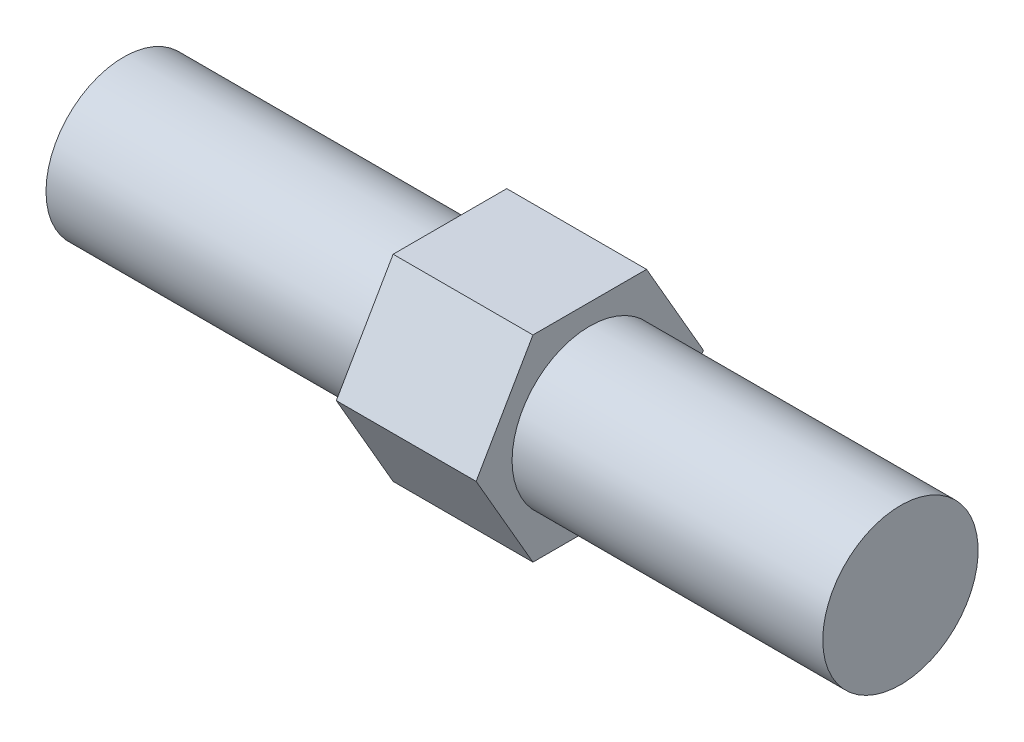
ISO-10303-21;
HEADER;
FILE_DESCRIPTION(('STEP AP214'),'2;1');
FILE_NAME('part.step','',(''),(''),'','','');
FILE_SCHEMA(('AUTOMOTIVE_DESIGN { 1 0 10303 214 1 1 1 1 }'));
ENDSEC;
DATA;
#1=APPLICATION_CONTEXT('core data for automotive mechanical design processes');
#2=APPLICATION_PROTOCOL_DEFINITION('international standard','automotive_design',2000,#1);
#3=PRODUCT_CONTEXT('',#1,'mechanical');
#4=PRODUCT('Part','Part','',(#3));
#5=PRODUCT_RELATED_PRODUCT_CATEGORY('part','',(#4));
#6=PRODUCT_DEFINITION_FORMATION('','',#4);
#7=PRODUCT_DEFINITION_CONTEXT('part definition',#1,'design');
#8=PRODUCT_DEFINITION('design','',#6,#7);
#9=PRODUCT_DEFINITION_SHAPE('','',#8);
#10=(LENGTH_UNIT() NAMED_UNIT(*) SI_UNIT(.MILLI.,.METRE.));
#11=(NAMED_UNIT(*) PLANE_ANGLE_UNIT() SI_UNIT($,.RADIAN.));
#12=(NAMED_UNIT(*) SI_UNIT($,.STERADIAN.) SOLID_ANGLE_UNIT());
#13=UNCERTAINTY_MEASURE_WITH_UNIT(LENGTH_MEASURE(1.E-05),#10,'distance_accuracy_value','');
#14=(GEOMETRIC_REPRESENTATION_CONTEXT(3) GLOBAL_UNCERTAINTY_ASSIGNED_CONTEXT((#13)) GLOBAL_UNIT_ASSIGNED_CONTEXT((#10,
#11,#12)) REPRESENTATION_CONTEXT('',''));
#15=CARTESIAN_POINT('',(0.,0.,0.));
#16=DIRECTION('',(0.,0.,1.));
#17=DIRECTION('',(1.,0.,0.));
#18=AXIS2_PLACEMENT_3D('',#15,#16,#17);
#19=CARTESIAN_POINT('',(-19.553100843704,0.,0.));
#20=DIRECTION('',(-1.,0.,0.));
#21=DIRECTION('',(0.,0.,1.));
#22=AXIS2_PLACEMENT_3D('',#19,#20,#21);
#23=CYLINDRICAL_SURFACE('',#22,1.5);
#24=CARTESIAN_POINT('',(-7.5,0.,0.));
#25=DIRECTION('',(-1.,0.,0.));
#26=DIRECTION('',(0.,0.,1.));
#27=AXIS2_PLACEMENT_3D('',#24,#25,#26);
#28=CIRCLE('',#27,1.5);
#29=CARTESIAN_POINT('',(-7.5,0.,1.5));
#30=VERTEX_POINT('',#29);
#31=EDGE_CURVE('E42',#30,#30,#28,.T.);
#32=ORIENTED_EDGE('',*,*,#31,.F.);
#33=EDGE_LOOP('',(#32));
#34=FACE_BOUND('',#33,.T.);
#35=CARTESIAN_POINT('',(-1.2,0.,0.));
#36=DIRECTION('',(1.,0.,0.));
#37=DIRECTION('',(0.,0.,-1.));
#38=AXIS2_PLACEMENT_3D('',#35,#36,#37);
#39=CIRCLE('',#38,1.5);
#40=CARTESIAN_POINT('',(-1.2,0.,-1.5));
#41=VERTEX_POINT('',#40);
#42=EDGE_CURVE('E11',#41,#41,#39,.T.);
#43=ORIENTED_EDGE('',*,*,#42,.F.);
#44=EDGE_LOOP('',(#43));
#45=FACE_BOUND('',#44,.T.);
#46=ADVANCED_FACE('F34',(#34,#45),#23,.T.);
#47=CARTESIAN_POINT('',(-7.5,0.,0.));
#48=DIRECTION('',(1.,0.,0.));
#49=DIRECTION('',(0.,0.,-1.));
#50=AXIS2_PLACEMENT_3D('',#47,#48,#49);
#51=PLANE('',#50);
#52=ORIENTED_EDGE('',*,*,#31,.T.);
#53=EDGE_LOOP('',(#52));
#54=FACE_BOUND('',#53,.T.);
#55=ADVANCED_FACE('F36',(#54),#51,.F.);
#56=CARTESIAN_POINT('',(-1.2,0.,0.));
#57=DIRECTION('',(1.,0.,0.));
#58=DIRECTION('',(0.,0.,-1.));
#59=AXIS2_PLACEMENT_3D('',#56,#57,#58);
#60=PLANE('',#59);
#61=DIRECTION('',(0.,0.866025403784439,-0.5));
#62=VECTOR('',#61,1.);
#63=CARTESIAN_POINT('',(-1.2,-1.9,-1.09696551146029));
#64=LINE('',#63,#62);
#65=CARTESIAN_POINT('',(-1.2,-1.9,-1.09696551146029));
#66=VERTEX_POINT('',#65);
#67=CARTESIAN_POINT('',(-1.2,0.,-2.19393102292058));
#68=VERTEX_POINT('',#67);
#69=EDGE_CURVE('E91',#66,#68,#64,.T.);
#70=ORIENTED_EDGE('',*,*,#69,.F.);
#71=DIRECTION('',(0.,0.,-1.));
#72=VECTOR('',#71,1.);
#73=CARTESIAN_POINT('',(-1.2,-1.9,1.09696551146029));
#74=LINE('',#73,#72);
#75=CARTESIAN_POINT('',(-1.2,-1.9,1.09696551146029));
#76=VERTEX_POINT('',#75);
#77=EDGE_CURVE('E96',#76,#66,#74,.T.);
#78=ORIENTED_EDGE('',*,*,#77,.F.);
#79=DIRECTION('',(0.,-0.866025403784439,-0.5));
#80=VECTOR('',#79,1.);
#81=CARTESIAN_POINT('',(-1.2,0.,2.19393102292058));
#82=LINE('',#81,#80);
#83=CARTESIAN_POINT('',(-1.2,0.,2.19393102292058));
#84=VERTEX_POINT('',#83);
#85=EDGE_CURVE('E129',#84,#76,#82,.T.);
#86=ORIENTED_EDGE('',*,*,#85,.F.);
#87=DIRECTION('',(0.,-0.866025403784439,0.5));
#88=VECTOR('',#87,1.);
#89=CARTESIAN_POINT('',(-1.2,1.9,1.09696551146029));
#90=LINE('',#89,#88);
#91=CARTESIAN_POINT('',(-1.2,1.9,1.09696551146029));
#92=VERTEX_POINT('',#91);
#93=EDGE_CURVE('E126',#92,#84,#90,.T.);
#94=ORIENTED_EDGE('',*,*,#93,.F.);
#95=DIRECTION('',(0.,0.,1.));
#96=VECTOR('',#95,1.);
#97=CARTESIAN_POINT('',(-1.2,1.9,-1.09696551146029));
#98=LINE('',#97,#96);
#99=CARTESIAN_POINT('',(-1.2,1.9,-1.09696551146029));
#100=VERTEX_POINT('',#99);
#101=EDGE_CURVE('E123',#100,#92,#98,.T.);
#102=ORIENTED_EDGE('',*,*,#101,.F.);
#103=DIRECTION('',(0.,0.866025403784439,0.5));
#104=VECTOR('',#103,1.);
#105=CARTESIAN_POINT('',(-1.2,0.,-2.19393102292058));
#106=LINE('',#105,#104);
#107=EDGE_CURVE('E121',#68,#100,#106,.T.);
#108=ORIENTED_EDGE('',*,*,#107,.F.);
#109=EDGE_LOOP('',(#70,#78,#86,#94,#102,#108));
#110=FACE_BOUND('',#109,.T.);
#111=ORIENTED_EDGE('',*,*,#42,.T.);
#112=EDGE_LOOP('',(#111));
#113=FACE_BOUND('',#112,.T.);
#114=ADVANCED_FACE('F150',(#110,#113),#60,.F.);
#115=CARTESIAN_POINT('',(1.5,0.,0.));
#116=DIRECTION('',(1.,0.,0.));
#117=DIRECTION('',(0.,0.,-1.));
#118=AXIS2_PLACEMENT_3D('',#115,#116,#117);
#119=PLANE('',#118);
#120=DIRECTION('',(0.,0.866025403784439,-0.5));
#121=VECTOR('',#120,1.);
#122=CARTESIAN_POINT('',(1.5,-1.9,-1.09696551146029));
#123=LINE('',#122,#121);
#124=CARTESIAN_POINT('',(1.5,-1.9,-1.09696551146029));
#125=VERTEX_POINT('',#124);
#126=CARTESIAN_POINT('',(1.5,0.,-2.19393102292058));
#127=VERTEX_POINT('',#126);
#128=EDGE_CURVE('E90',#125,#127,#123,.T.);
#129=ORIENTED_EDGE('',*,*,#128,.T.);
#130=DIRECTION('',(0.,0.866025403784439,0.5));
#131=VECTOR('',#130,1.);
#132=CARTESIAN_POINT('',(1.5,0.,-2.19393102292058));
#133=LINE('',#132,#131);
#134=CARTESIAN_POINT('',(1.5,1.9,-1.09696551146029));
#135=VERTEX_POINT('',#134);
#136=EDGE_CURVE('E99',#127,#135,#133,.T.);
#137=ORIENTED_EDGE('',*,*,#136,.T.);
#138=DIRECTION('',(0.,0.,1.));
#139=VECTOR('',#138,1.);
#140=CARTESIAN_POINT('',(1.5,1.9,-1.09696551146029));
#141=LINE('',#140,#139);
#142=CARTESIAN_POINT('',(1.5,1.9,1.09696551146029));
#143=VERTEX_POINT('',#142);
#144=EDGE_CURVE('E104',#135,#143,#141,.T.);
#145=ORIENTED_EDGE('',*,*,#144,.T.);
#146=DIRECTION('',(0.,-0.866025403784439,0.5));
#147=VECTOR('',#146,1.);
#148=CARTESIAN_POINT('',(1.5,1.9,1.09696551146029));
#149=LINE('',#148,#147);
#150=CARTESIAN_POINT('',(1.5,0.,2.19393102292058));
#151=VERTEX_POINT('',#150);
#152=EDGE_CURVE('E114',#143,#151,#149,.T.);
#153=ORIENTED_EDGE('',*,*,#152,.T.);
#154=DIRECTION('',(0.,-0.866025403784439,-0.5));
#155=VECTOR('',#154,1.);
#156=CARTESIAN_POINT('',(1.5,0.,2.19393102292058));
#157=LINE('',#156,#155);
#158=CARTESIAN_POINT('',(1.5,-1.9,1.09696551146029));
#159=VERTEX_POINT('',#158);
#160=EDGE_CURVE('E117',#151,#159,#157,.T.);
#161=ORIENTED_EDGE('',*,*,#160,.T.);
#162=DIRECTION('',(0.,0.,-1.));
#163=VECTOR('',#162,1.);
#164=CARTESIAN_POINT('',(1.5,-1.9,1.09696551146029));
#165=LINE('',#164,#163);
#166=EDGE_CURVE('E110',#159,#125,#165,.T.);
#167=ORIENTED_EDGE('',*,*,#166,.T.);
#168=EDGE_LOOP('',(#129,#137,#145,#153,#161,#167));
#169=FACE_BOUND('',#168,.T.);
#170=CARTESIAN_POINT('',(1.5,0.,0.));
#171=DIRECTION('',(1.,0.,0.));
#172=DIRECTION('',(0.,0.,-1.));
#173=AXIS2_PLACEMENT_3D('',#170,#171,#172);
#174=CIRCLE('',#173,1.5);
#175=CARTESIAN_POINT('',(1.5,0.,-1.5));
#176=VERTEX_POINT('',#175);
#177=EDGE_CURVE('E133',#176,#176,#174,.T.);
#178=ORIENTED_EDGE('',*,*,#177,.F.);
#179=EDGE_LOOP('',(#178));
#180=FACE_BOUND('',#179,.T.);
#181=ADVANCED_FACE('F107',(#169,#180),#119,.T.);
#182=CARTESIAN_POINT('',(-1.2,-1.9,-1.09696551146029));
#183=DIRECTION('',(0.,-0.5,-0.866025403784439));
#184=DIRECTION('',(0.,0.866025403784439,-0.5));
#185=AXIS2_PLACEMENT_3D('',#182,#183,#184);
#186=PLANE('',#185);
#187=DIRECTION('',(1.,0.,0.));
#188=VECTOR('',#187,1.);
#189=CARTESIAN_POINT('',(-1.2,0.,-2.19393102292058));
#190=LINE('',#189,#188);
#191=EDGE_CURVE('E86',#68,#127,#190,.T.);
#192=ORIENTED_EDGE('',*,*,#191,.T.);
#193=ORIENTED_EDGE('',*,*,#128,.F.);
#194=DIRECTION('',(1.,0.,0.));
#195=VECTOR('',#194,1.);
#196=CARTESIAN_POINT('',(-1.2,-1.9,-1.09696551146029));
#197=LINE('',#196,#195);
#198=EDGE_CURVE('E49',#66,#125,#197,.T.);
#199=ORIENTED_EDGE('',*,*,#198,.F.);
#200=ORIENTED_EDGE('',*,*,#69,.T.);
#201=EDGE_LOOP('',(#192,#193,#199,#200));
#202=FACE_BOUND('',#201,.T.);
#203=ADVANCED_FACE('F88',(#202),#186,.T.);
#204=CARTESIAN_POINT('',(-1.2,-1.9,1.09696551146029));
#205=DIRECTION('',(0.,-1.,0.));
#206=DIRECTION('',(0.,0.,-1.));
#207=AXIS2_PLACEMENT_3D('',#204,#205,#206);
#208=PLANE('',#207);
#209=ORIENTED_EDGE('',*,*,#198,.T.);
#210=ORIENTED_EDGE('',*,*,#166,.F.);
#211=DIRECTION('',(1.,0.,0.));
#212=VECTOR('',#211,1.);
#213=CARTESIAN_POINT('',(-1.2,-1.9,1.09696551146029));
#214=LINE('',#213,#212);
#215=EDGE_CURVE('E57',#76,#159,#214,.T.);
#216=ORIENTED_EDGE('',*,*,#215,.F.);
#217=ORIENTED_EDGE('',*,*,#77,.T.);
#218=EDGE_LOOP('',(#209,#210,#216,#217));
#219=FACE_BOUND('',#218,.T.);
#220=ADVANCED_FACE('F156',(#219),#208,.T.);
#221=CARTESIAN_POINT('',(-1.2,0.,2.19393102292058));
#222=DIRECTION('',(0.,-0.5,0.866025403784439));
#223=DIRECTION('',(0.,-0.866025403784439,-0.5));
#224=AXIS2_PLACEMENT_3D('',#221,#222,#223);
#225=PLANE('',#224);
#226=ORIENTED_EDGE('',*,*,#215,.T.);
#227=ORIENTED_EDGE('',*,*,#160,.F.);
#228=DIRECTION('',(1.,0.,0.));
#229=VECTOR('',#228,1.);
#230=CARTESIAN_POINT('',(-1.2,0.,2.19393102292058));
#231=LINE('',#230,#229);
#232=EDGE_CURVE('E135',#84,#151,#231,.T.);
#233=ORIENTED_EDGE('',*,*,#232,.F.);
#234=ORIENTED_EDGE('',*,*,#85,.T.);
#235=EDGE_LOOP('',(#226,#227,#233,#234));
#236=FACE_BOUND('',#235,.T.);
#237=ADVANCED_FACE('F188',(#236),#225,.T.);
#238=CARTESIAN_POINT('',(-1.2,1.9,1.09696551146029));
#239=DIRECTION('',(0.,0.5,0.866025403784438));
#240=DIRECTION('',(0.,-0.866025403784439,0.5));
#241=AXIS2_PLACEMENT_3D('',#238,#239,#240);
#242=PLANE('',#241);
#243=ORIENTED_EDGE('',*,*,#232,.T.);
#244=ORIENTED_EDGE('',*,*,#152,.F.);
#245=DIRECTION('',(1.,0.,0.));
#246=VECTOR('',#245,1.);
#247=CARTESIAN_POINT('',(-1.2,1.9,1.09696551146029));
#248=LINE('',#247,#246);
#249=EDGE_CURVE('E137',#92,#143,#248,.T.);
#250=ORIENTED_EDGE('',*,*,#249,.F.);
#251=ORIENTED_EDGE('',*,*,#93,.T.);
#252=EDGE_LOOP('',(#243,#244,#250,#251));
#253=FACE_BOUND('',#252,.T.);
#254=ADVANCED_FACE('F184',(#253),#242,.T.);
#255=CARTESIAN_POINT('',(-1.2,1.9,-1.09696551146029));
#256=DIRECTION('',(0.,1.,0.));
#257=DIRECTION('',(0.,0.,1.));
#258=AXIS2_PLACEMENT_3D('',#255,#256,#257);
#259=PLANE('',#258);
#260=ORIENTED_EDGE('',*,*,#249,.T.);
#261=ORIENTED_EDGE('',*,*,#144,.F.);
#262=DIRECTION('',(1.,0.,0.));
#263=VECTOR('',#262,1.);
#264=CARTESIAN_POINT('',(-1.2,1.9,-1.09696551146029));
#265=LINE('',#264,#263);
#266=EDGE_CURVE('E95',#100,#135,#265,.T.);
#267=ORIENTED_EDGE('',*,*,#266,.F.);
#268=ORIENTED_EDGE('',*,*,#101,.T.);
#269=EDGE_LOOP('',(#260,#261,#267,#268));
#270=FACE_BOUND('',#269,.T.);
#271=ADVANCED_FACE('F178',(#270),#259,.T.);
#272=CARTESIAN_POINT('',(-1.2,0.,-2.19393102292058));
#273=DIRECTION('',(0.,0.5,-0.866025403784439));
#274=DIRECTION('',(0.,0.866025403784439,0.5));
#275=AXIS2_PLACEMENT_3D('',#272,#273,#274);
#276=PLANE('',#275);
#277=ORIENTED_EDGE('',*,*,#266,.T.);
#278=ORIENTED_EDGE('',*,*,#136,.F.);
#279=ORIENTED_EDGE('',*,*,#191,.F.);
#280=ORIENTED_EDGE('',*,*,#107,.T.);
#281=EDGE_LOOP('',(#277,#278,#279,#280));
#282=FACE_BOUND('',#281,.T.);
#283=ADVANCED_FACE('F100',(#282),#276,.T.);
#284=CARTESIAN_POINT('',(7.5,0.,-1.5));
#285=DIRECTION('',(-1.,0.,0.));
#286=DIRECTION('',(0.,0.,1.));
#287=AXIS2_PLACEMENT_3D('',#284,#285,#286);
#288=PLANE('',#287);
#289=CARTESIAN_POINT('',(7.5,0.,0.));
#290=DIRECTION('',(-1.,0.,0.));
#291=DIRECTION('',(0.,0.,1.));
#292=AXIS2_PLACEMENT_3D('',#289,#290,#291);
#293=CIRCLE('',#292,1.5);
#294=CARTESIAN_POINT('',(7.5,0.,1.5));
#295=VERTEX_POINT('',#294);
#296=EDGE_CURVE('E140',#295,#295,#293,.T.);
#297=ORIENTED_EDGE('',*,*,#296,.F.);
#298=EDGE_LOOP('',(#297));
#299=FACE_BOUND('',#298,.T.);
#300=ADVANCED_FACE('F170',(#299),#288,.F.);
#301=ORIENTED_EDGE('',*,*,#177,.T.);
#302=EDGE_LOOP('',(#301));
#303=FACE_BOUND('',#302,.T.);
#304=ORIENTED_EDGE('',*,*,#296,.T.);
#305=EDGE_LOOP('',(#304));
#306=FACE_BOUND('',#305,.T.);
#307=ADVANCED_FACE('F147',(#303,#306),#23,.T.);
#308=CLOSED_SHELL('',(#46,#55,#114,#181,#203,#220,#237,#254,#271,#283,#300,#307));
#309=MANIFOLD_SOLID_BREP('B2',#308);
#310=ADVANCED_BREP_SHAPE_REPRESENTATION('',(#18,#309),#14);
#311=SHAPE_DEFINITION_REPRESENTATION(#9,#310);
ENDSEC;
END-ISO-10303-21;
